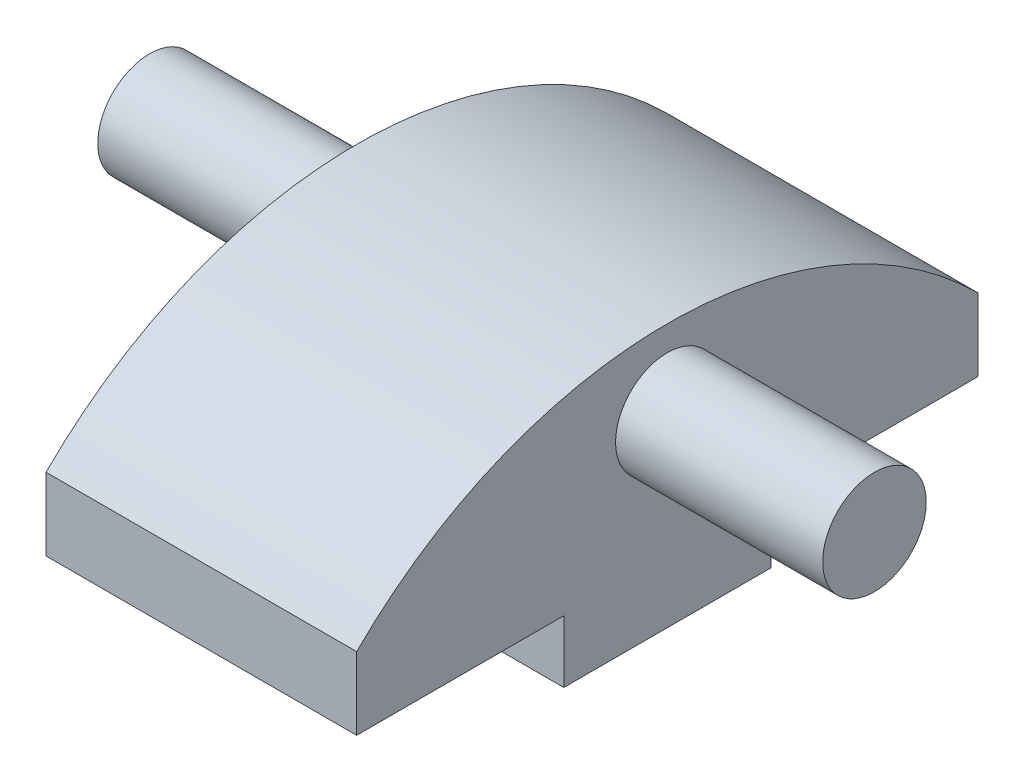
ISO-10303-21;
HEADER;
FILE_DESCRIPTION(('STEP AP214'),'2;1');
FILE_NAME('part.step','',(''),(''),'','','');
FILE_SCHEMA(('AUTOMOTIVE_DESIGN { 1 0 10303 214 1 1 1 1 }'));
ENDSEC;
DATA;
#1=APPLICATION_CONTEXT('core data for automotive mechanical design processes');
#2=APPLICATION_PROTOCOL_DEFINITION('international standard','automotive_design',2000,#1);
#3=PRODUCT_CONTEXT('',#1,'mechanical');
#4=PRODUCT('Part','Part','',(#3));
#5=PRODUCT_RELATED_PRODUCT_CATEGORY('part','',(#4));
#6=PRODUCT_DEFINITION_FORMATION('','',#4);
#7=PRODUCT_DEFINITION_CONTEXT('part definition',#1,'design');
#8=PRODUCT_DEFINITION('design','',#6,#7);
#9=PRODUCT_DEFINITION_SHAPE('','',#8);
#10=(LENGTH_UNIT() NAMED_UNIT(*) SI_UNIT(.MILLI.,.METRE.));
#11=(NAMED_UNIT(*) PLANE_ANGLE_UNIT() SI_UNIT($,.RADIAN.));
#12=(NAMED_UNIT(*) SI_UNIT($,.STERADIAN.) SOLID_ANGLE_UNIT());
#13=UNCERTAINTY_MEASURE_WITH_UNIT(LENGTH_MEASURE(1.E-05),#10,'distance_accuracy_value','');
#14=(GEOMETRIC_REPRESENTATION_CONTEXT(3) GLOBAL_UNCERTAINTY_ASSIGNED_CONTEXT((#13)) GLOBAL_UNIT_ASSIGNED_CONTEXT((#10,
#11,#12)) REPRESENTATION_CONTEXT('',''));
#15=CARTESIAN_POINT('',(0.,0.,0.));
#16=DIRECTION('',(0.,0.,1.));
#17=DIRECTION('',(1.,0.,0.));
#18=AXIS2_PLACEMENT_3D('',#15,#16,#17);
#19=CARTESIAN_POINT('',(40.,5.,55.));
#20=DIRECTION('',(0.,1.,0.));
#21=DIRECTION('',(0.,0.,1.));
#22=AXIS2_PLACEMENT_3D('',#19,#20,#21);
#23=PLANE('',#22);
#24=DIRECTION('',(1.,0.,0.));
#25=VECTOR('',#24,1.);
#26=CARTESIAN_POINT('',(-15.,5.,-10.));
#27=LINE('',#26,#25);
#28=CARTESIAN_POINT('',(-15.,5.,-10.));
#29=VERTEX_POINT('',#28);
#30=CARTESIAN_POINT('',(15.,5.,-10.));
#31=VERTEX_POINT('',#30);
#32=EDGE_CURVE('E130',#29,#31,#27,.T.);
#33=ORIENTED_EDGE('',*,*,#32,.F.);
#34=DIRECTION('',(0.,0.,1.));
#35=VECTOR('',#34,1.);
#36=CARTESIAN_POINT('',(-15.,5.,30.));
#37=LINE('',#36,#35);
#38=CARTESIAN_POINT('',(-15.,5.,-30.));
#39=VERTEX_POINT('',#38);
#40=EDGE_CURVE('E175',#39,#29,#37,.T.);
#41=ORIENTED_EDGE('',*,*,#40,.F.);
#42=DIRECTION('',(-1.,0.,0.));
#43=VECTOR('',#42,1.);
#44=CARTESIAN_POINT('',(-15.,5.,-30.));
#45=LINE('',#44,#43);
#46=CARTESIAN_POINT('',(15.,5.,-30.));
#47=VERTEX_POINT('',#46);
#48=EDGE_CURVE('E171',#47,#39,#45,.T.);
#49=ORIENTED_EDGE('',*,*,#48,.F.);
#50=DIRECTION('',(0.,0.,-1.));
#51=VECTOR('',#50,1.);
#52=CARTESIAN_POINT('',(15.,5.,30.));
#53=LINE('',#52,#51);
#54=EDGE_CURVE('E59',#31,#47,#53,.T.);
#55=ORIENTED_EDGE('',*,*,#54,.F.);
#56=EDGE_LOOP('',(#33,#41,#49,#55));
#57=FACE_BOUND('',#56,.T.);
#58=ADVANCED_FACE('F43',(#57),#23,.F.);
#59=DIRECTION('',(-1.,0.,0.));
#60=VECTOR('',#59,1.);
#61=CARTESIAN_POINT('',(-15.,5.,10.));
#62=LINE('',#61,#60);
#63=CARTESIAN_POINT('',(15.,5.,10.));
#64=VERTEX_POINT('',#63);
#65=CARTESIAN_POINT('',(-15.,5.,10.));
#66=VERTEX_POINT('',#65);
#67=EDGE_CURVE('E67',#64,#66,#62,.T.);
#68=ORIENTED_EDGE('',*,*,#67,.F.);
#69=CARTESIAN_POINT('',(15.,5.,30.));
#70=VERTEX_POINT('',#69);
#71=EDGE_CURVE('E135',#70,#64,#53,.T.);
#72=ORIENTED_EDGE('',*,*,#71,.F.);
#73=DIRECTION('',(1.,0.,0.));
#74=VECTOR('',#73,1.);
#75=CARTESIAN_POINT('',(-15.,5.,30.));
#76=LINE('',#75,#74);
#77=CARTESIAN_POINT('',(-15.,5.,30.));
#78=VERTEX_POINT('',#77);
#79=EDGE_CURVE('E179',#78,#70,#76,.T.);
#80=ORIENTED_EDGE('',*,*,#79,.F.);
#81=EDGE_CURVE('E174',#66,#78,#37,.T.);
#82=ORIENTED_EDGE('',*,*,#81,.F.);
#83=EDGE_LOOP('',(#68,#72,#80,#82));
#84=FACE_BOUND('',#83,.T.);
#85=ADVANCED_FACE('F219',(#84),#23,.F.);
#86=CARTESIAN_POINT('',(15.,29.,30.));
#87=DIRECTION('',(-1.,0.,0.));
#88=DIRECTION('',(0.,0.,1.));
#89=AXIS2_PLACEMENT_3D('',#86,#87,#88);
#90=PLANE('',#89);
#91=CARTESIAN_POINT('',(15.,17.,0.));
#92=DIRECTION('',(-1.,0.,0.));
#93=DIRECTION('',(0.,0.,1.));
#94=AXIS2_PLACEMENT_3D('',#91,#92,#93);
#95=CIRCLE('',#94,5.);
#96=CARTESIAN_POINT('',(15.,17.,5.));
#97=VERTEX_POINT('',#96);
#98=EDGE_CURVE('E165',#97,#97,#95,.T.);
#99=ORIENTED_EDGE('',*,*,#98,.T.);
#100=EDGE_LOOP('',(#99));
#101=FACE_BOUND('',#100,.T.);
#102=DIRECTION('',(0.,-1.,0.));
#103=VECTOR('',#102,1.);
#104=CARTESIAN_POINT('',(15.,29.,-30.));
#105=LINE('',#104,#103);
#106=CARTESIAN_POINT('',(15.,12.,-30.));
#107=VERTEX_POINT('',#106);
#108=EDGE_CURVE('E11',#107,#47,#105,.T.);
#109=ORIENTED_EDGE('',*,*,#108,.F.);
#110=CARTESIAN_POINT('',(15.,-18.,0.));
#111=DIRECTION('',(-1.,0.,0.));
#112=DIRECTION('',(0.,0.,1.));
#113=AXIS2_PLACEMENT_3D('',#110,#111,#112);
#114=CIRCLE('',#113,42.4264068711929);
#115=CARTESIAN_POINT('',(15.,12.,30.));
#116=VERTEX_POINT('',#115);
#117=EDGE_CURVE('E150',#107,#116,#114,.F.);
#118=ORIENTED_EDGE('',*,*,#117,.T.);
#119=DIRECTION('',(0.,-1.,0.));
#120=VECTOR('',#119,1.);
#121=CARTESIAN_POINT('',(15.,29.,30.));
#122=LINE('',#121,#120);
#123=EDGE_CURVE('E183',#116,#70,#122,.T.);
#124=ORIENTED_EDGE('',*,*,#123,.T.);
#125=ORIENTED_EDGE('',*,*,#71,.T.);
#126=DIRECTION('',(0.,1.,0.));
#127=VECTOR('',#126,1.);
#128=CARTESIAN_POINT('',(15.,-1.,10.));
#129=LINE('',#128,#127);
#130=CARTESIAN_POINT('',(15.,-1.,10.));
#131=VERTEX_POINT('',#130);
#132=EDGE_CURVE('E113',#131,#64,#129,.T.);
#133=ORIENTED_EDGE('',*,*,#132,.F.);
#134=DIRECTION('',(0.,0.,1.));
#135=VECTOR('',#134,1.);
#136=CARTESIAN_POINT('',(15.,-1.,-10.));
#137=LINE('',#136,#135);
#138=CARTESIAN_POINT('',(15.,-1.,-10.));
#139=VERTEX_POINT('',#138);
#140=EDGE_CURVE('E120',#139,#131,#137,.T.);
#141=ORIENTED_EDGE('',*,*,#140,.F.);
#142=DIRECTION('',(0.,1.,0.));
#143=VECTOR('',#142,1.);
#144=CARTESIAN_POINT('',(15.,-1.,-10.));
#145=LINE('',#144,#143);
#146=EDGE_CURVE('E210',#139,#31,#145,.T.);
#147=ORIENTED_EDGE('',*,*,#146,.T.);
#148=ORIENTED_EDGE('',*,*,#54,.T.);
#149=EDGE_LOOP('',(#109,#118,#124,#125,#133,#141,#147,#148));
#150=FACE_BOUND('',#149,.T.);
#151=ADVANCED_FACE('F133',(#101,#150),#90,.F.);
#152=CARTESIAN_POINT('',(-15.,29.,-30.));
#153=DIRECTION('',(0.,0.,1.));
#154=DIRECTION('',(1.,0.,0.));
#155=AXIS2_PLACEMENT_3D('',#152,#153,#154);
#156=PLANE('',#155);
#157=DIRECTION('',(0.,-1.,0.));
#158=VECTOR('',#157,1.);
#159=CARTESIAN_POINT('',(-15.,29.,-30.));
#160=LINE('',#159,#158);
#161=CARTESIAN_POINT('',(-15.,12.,-30.));
#162=VERTEX_POINT('',#161);
#163=EDGE_CURVE('E52',#162,#39,#160,.T.);
#164=ORIENTED_EDGE('',*,*,#163,.F.);
#165=DIRECTION('',(-1.,0.,0.));
#166=VECTOR('',#165,1.);
#167=CARTESIAN_POINT('',(45.,12.,-30.));
#168=LINE('',#167,#166);
#169=EDGE_CURVE('E147',#107,#162,#168,.T.);
#170=ORIENTED_EDGE('',*,*,#169,.F.);
#171=ORIENTED_EDGE('',*,*,#108,.T.);
#172=ORIENTED_EDGE('',*,*,#48,.T.);
#173=EDGE_LOOP('',(#164,#170,#171,#172));
#174=FACE_BOUND('',#173,.T.);
#175=ADVANCED_FACE('F202',(#174),#156,.F.);
#176=CARTESIAN_POINT('',(-15.,29.,30.));
#177=DIRECTION('',(1.,0.,0.));
#178=DIRECTION('',(0.,0.,-1.));
#179=AXIS2_PLACEMENT_3D('',#176,#177,#178);
#180=PLANE('',#179);
#181=CARTESIAN_POINT('',(-15.,17.,0.));
#182=DIRECTION('',(1.,0.,0.));
#183=DIRECTION('',(0.,0.,-1.));
#184=AXIS2_PLACEMENT_3D('',#181,#182,#183);
#185=CIRCLE('',#184,5.);
#186=CARTESIAN_POINT('',(-15.,17.,-5.));
#187=VERTEX_POINT('',#186);
#188=EDGE_CURVE('E46',#187,#187,#185,.T.);
#189=ORIENTED_EDGE('',*,*,#188,.T.);
#190=EDGE_LOOP('',(#189));
#191=FACE_BOUND('',#190,.T.);
#192=DIRECTION('',(0.,-1.,0.));
#193=VECTOR('',#192,1.);
#194=CARTESIAN_POINT('',(-15.,29.,30.));
#195=LINE('',#194,#193);
#196=CARTESIAN_POINT('',(-15.,12.,30.));
#197=VERTEX_POINT('',#196);
#198=EDGE_CURVE('E186',#197,#78,#195,.T.);
#199=ORIENTED_EDGE('',*,*,#198,.F.);
#200=CARTESIAN_POINT('',(-15.,-18.,0.));
#201=DIRECTION('',(1.,0.,0.));
#202=DIRECTION('',(0.,0.,-1.));
#203=AXIS2_PLACEMENT_3D('',#200,#201,#202);
#204=CIRCLE('',#203,42.4264068711929);
#205=EDGE_CURVE('E137',#162,#197,#204,.T.);
#206=ORIENTED_EDGE('',*,*,#205,.F.);
#207=ORIENTED_EDGE('',*,*,#163,.T.);
#208=ORIENTED_EDGE('',*,*,#40,.T.);
#209=DIRECTION('',(0.,1.,0.));
#210=VECTOR('',#209,1.);
#211=CARTESIAN_POINT('',(-15.,-1.,-10.));
#212=LINE('',#211,#210);
#213=CARTESIAN_POINT('',(-15.,-1.,-10.));
#214=VERTEX_POINT('',#213);
#215=EDGE_CURVE('E143',#214,#29,#212,.T.);
#216=ORIENTED_EDGE('',*,*,#215,.F.);
#217=DIRECTION('',(0.,0.,-1.));
#218=VECTOR('',#217,1.);
#219=CARTESIAN_POINT('',(-15.,-1.,-10.));
#220=LINE('',#219,#218);
#221=CARTESIAN_POINT('',(-15.,-1.,10.));
#222=VERTEX_POINT('',#221);
#223=EDGE_CURVE('E119',#222,#214,#220,.T.);
#224=ORIENTED_EDGE('',*,*,#223,.F.);
#225=DIRECTION('',(0.,1.,0.));
#226=VECTOR('',#225,1.);
#227=CARTESIAN_POINT('',(-15.,-1.,10.));
#228=LINE('',#227,#226);
#229=EDGE_CURVE('E115',#222,#66,#228,.T.);
#230=ORIENTED_EDGE('',*,*,#229,.T.);
#231=ORIENTED_EDGE('',*,*,#81,.T.);
#232=EDGE_LOOP('',(#199,#206,#207,#208,#216,#224,#230,#231));
#233=FACE_BOUND('',#232,.T.);
#234=ADVANCED_FACE('F196',(#191,#233),#180,.F.);
#235=CARTESIAN_POINT('',(-15.,29.,30.));
#236=DIRECTION('',(0.,0.,-1.));
#237=DIRECTION('',(-1.,0.,0.));
#238=AXIS2_PLACEMENT_3D('',#235,#236,#237);
#239=PLANE('',#238);
#240=ORIENTED_EDGE('',*,*,#123,.F.);
#241=DIRECTION('',(-1.,0.,0.));
#242=VECTOR('',#241,1.);
#243=CARTESIAN_POINT('',(45.,12.,30.));
#244=LINE('',#243,#242);
#245=EDGE_CURVE('E141',#116,#197,#244,.T.);
#246=ORIENTED_EDGE('',*,*,#245,.T.);
#247=ORIENTED_EDGE('',*,*,#198,.T.);
#248=ORIENTED_EDGE('',*,*,#79,.T.);
#249=EDGE_LOOP('',(#240,#246,#247,#248));
#250=FACE_BOUND('',#249,.T.);
#251=ADVANCED_FACE('F222',(#250),#239,.F.);
#252=CARTESIAN_POINT('',(-35.,17.,0.));
#253=DIRECTION('',(1.,0.,0.));
#254=DIRECTION('',(0.,0.,-1.));
#255=AXIS2_PLACEMENT_3D('',#252,#253,#254);
#256=PLANE('',#255);
#257=CARTESIAN_POINT('',(-35.,17.,0.));
#258=DIRECTION('',(1.,0.,0.));
#259=DIRECTION('',(0.,0.,-1.));
#260=AXIS2_PLACEMENT_3D('',#257,#258,#259);
#261=CIRCLE('',#260,5.);
#262=CARTESIAN_POINT('',(-35.,17.,-5.));
#263=VERTEX_POINT('',#262);
#264=EDGE_CURVE('E161',#263,#263,#261,.T.);
#265=ORIENTED_EDGE('',*,*,#264,.F.);
#266=EDGE_LOOP('',(#265));
#267=FACE_BOUND('',#266,.T.);
#268=ADVANCED_FACE('F234',(#267),#256,.F.);
#269=CARTESIAN_POINT('',(-35.,17.,0.));
#270=DIRECTION('',(1.,0.,0.));
#271=DIRECTION('',(0.,0.,-1.));
#272=AXIS2_PLACEMENT_3D('',#269,#270,#271);
#273=CYLINDRICAL_SURFACE('',#272,5.);
#274=ORIENTED_EDGE('',*,*,#264,.T.);
#275=EDGE_LOOP('',(#274));
#276=FACE_BOUND('',#275,.T.);
#277=ORIENTED_EDGE('',*,*,#188,.F.);
#278=EDGE_LOOP('',(#277));
#279=FACE_BOUND('',#278,.T.);
#280=ADVANCED_FACE('F231',(#276,#279),#273,.T.);
#281=CARTESIAN_POINT('',(35.,17.,0.));
#282=DIRECTION('',(1.,0.,0.));
#283=DIRECTION('',(0.,0.,-1.));
#284=AXIS2_PLACEMENT_3D('',#281,#282,#283);
#285=CIRCLE('',#284,5.);
#286=CARTESIAN_POINT('',(35.,17.,-5.));
#287=VERTEX_POINT('',#286);
#288=EDGE_CURVE('E157',#287,#287,#285,.T.);
#289=ORIENTED_EDGE('',*,*,#288,.F.);
#290=EDGE_LOOP('',(#289));
#291=FACE_BOUND('',#290,.T.);
#292=ORIENTED_EDGE('',*,*,#98,.F.);
#293=EDGE_LOOP('',(#292));
#294=FACE_BOUND('',#293,.T.);
#295=ADVANCED_FACE('F233',(#291,#294),#273,.T.);
#296=CARTESIAN_POINT('',(35.,17.,0.));
#297=DIRECTION('',(1.,0.,0.));
#298=DIRECTION('',(0.,0.,-1.));
#299=AXIS2_PLACEMENT_3D('',#296,#297,#298);
#300=PLANE('',#299);
#301=ORIENTED_EDGE('',*,*,#288,.T.);
#302=EDGE_LOOP('',(#301));
#303=FACE_BOUND('',#302,.T.);
#304=ADVANCED_FACE('F241',(#303),#300,.T.);
#305=CARTESIAN_POINT('',(45.,-18.,0.));
#306=DIRECTION('',(-1.,0.,0.));
#307=DIRECTION('',(0.,0.,1.));
#308=AXIS2_PLACEMENT_3D('',#305,#306,#307);
#309=CYLINDRICAL_SURFACE('',#308,42.4264068711929);
#310=ORIENTED_EDGE('',*,*,#169,.T.);
#311=ORIENTED_EDGE('',*,*,#205,.T.);
#312=ORIENTED_EDGE('',*,*,#245,.F.);
#313=ORIENTED_EDGE('',*,*,#117,.F.);
#314=EDGE_LOOP('',(#310,#311,#312,#313));
#315=FACE_BOUND('',#314,.T.);
#316=ADVANCED_FACE('F224',(#315),#309,.T.);
#317=CARTESIAN_POINT('',(-15.,-1.,10.));
#318=DIRECTION('',(0.,0.,-1.));
#319=DIRECTION('',(-1.,0.,0.));
#320=AXIS2_PLACEMENT_3D('',#317,#318,#319);
#321=PLANE('',#320);
#322=ORIENTED_EDGE('',*,*,#67,.T.);
#323=ORIENTED_EDGE('',*,*,#229,.F.);
#324=DIRECTION('',(-1.,0.,0.));
#325=VECTOR('',#324,1.);
#326=CARTESIAN_POINT('',(-15.,-1.,10.));
#327=LINE('',#326,#325);
#328=EDGE_CURVE('E109',#131,#222,#327,.T.);
#329=ORIENTED_EDGE('',*,*,#328,.F.);
#330=ORIENTED_EDGE('',*,*,#132,.T.);
#331=EDGE_LOOP('',(#322,#323,#329,#330));
#332=FACE_BOUND('',#331,.T.);
#333=ADVANCED_FACE('F111',(#332),#321,.F.);
#334=CARTESIAN_POINT('',(-15.,-1.,-10.));
#335=DIRECTION('',(0.,0.,1.));
#336=DIRECTION('',(1.,0.,0.));
#337=AXIS2_PLACEMENT_3D('',#334,#335,#336);
#338=PLANE('',#337);
#339=ORIENTED_EDGE('',*,*,#32,.T.);
#340=ORIENTED_EDGE('',*,*,#146,.F.);
#341=DIRECTION('',(1.,0.,0.));
#342=VECTOR('',#341,1.);
#343=CARTESIAN_POINT('',(-15.,-1.,-10.));
#344=LINE('',#343,#342);
#345=EDGE_CURVE('E125',#214,#139,#344,.T.);
#346=ORIENTED_EDGE('',*,*,#345,.F.);
#347=ORIENTED_EDGE('',*,*,#215,.T.);
#348=EDGE_LOOP('',(#339,#340,#346,#347));
#349=FACE_BOUND('',#348,.T.);
#350=ADVANCED_FACE('F213',(#349),#338,.F.);
#351=CARTESIAN_POINT('',(0.,-1.,0.));
#352=DIRECTION('',(0.,1.,0.));
#353=DIRECTION('',(0.,0.,1.));
#354=AXIS2_PLACEMENT_3D('',#351,#352,#353);
#355=PLANE('',#354);
#356=ORIENTED_EDGE('',*,*,#140,.T.);
#357=ORIENTED_EDGE('',*,*,#328,.T.);
#358=ORIENTED_EDGE('',*,*,#223,.T.);
#359=ORIENTED_EDGE('',*,*,#345,.T.);
#360=EDGE_LOOP('',(#356,#357,#358,#359));
#361=FACE_BOUND('',#360,.T.);
#362=ADVANCED_FACE('F123',(#361),#355,.F.);
#363=CLOSED_SHELL('',(#58,#85,#151,#175,#234,#251,#268,#280,#295,#304,#316,#333,#350,#362));
#364=MANIFOLD_SOLID_BREP('B2',#363);
#365=ADVANCED_BREP_SHAPE_REPRESENTATION('',(#18,#364),#14);
#366=SHAPE_DEFINITION_REPRESENTATION(#9,#365);
ENDSEC;
END-ISO-10303-21;
